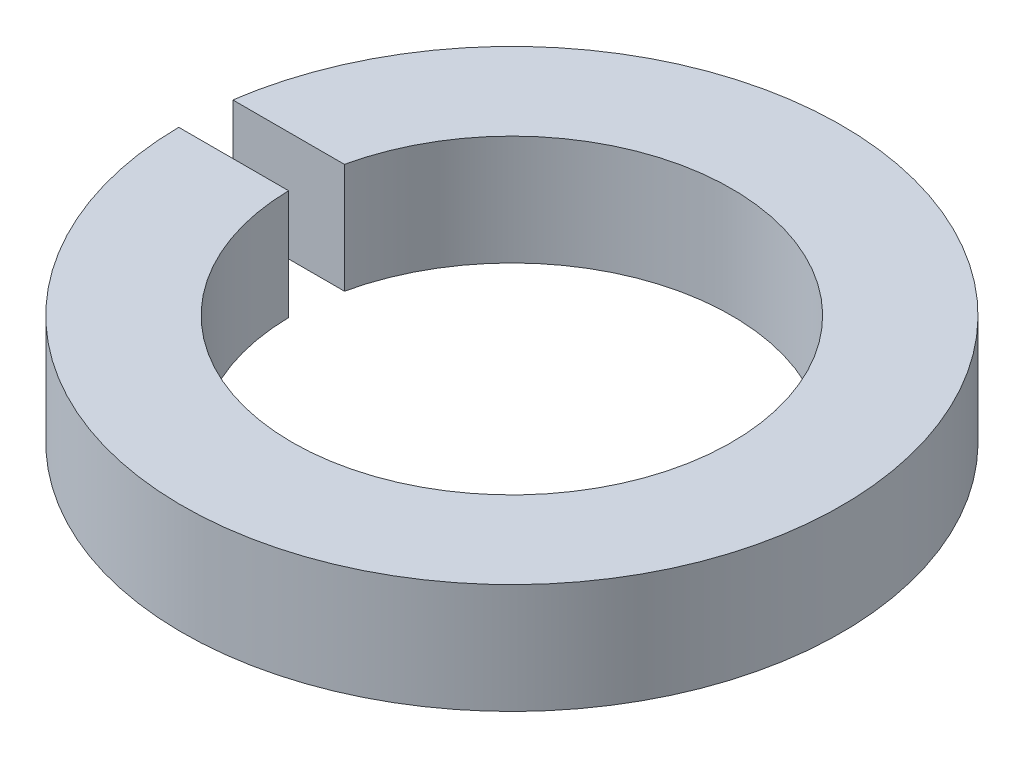
ISO-10303-21;
HEADER;
FILE_DESCRIPTION(('STEP AP214'),'2;1');
FILE_NAME('part.step','',(''),(''),'','','');
FILE_SCHEMA(('AUTOMOTIVE_DESIGN { 1 0 10303 214 1 1 1 1 }'));
ENDSEC;
DATA;
#1=APPLICATION_CONTEXT('core data for automotive mechanical design processes');
#2=APPLICATION_PROTOCOL_DEFINITION('international standard','automotive_design',2000,#1);
#3=PRODUCT_CONTEXT('',#1,'mechanical');
#4=PRODUCT('Part','Part','',(#3));
#5=PRODUCT_RELATED_PRODUCT_CATEGORY('part','',(#4));
#6=PRODUCT_DEFINITION_FORMATION('','',#4);
#7=PRODUCT_DEFINITION_CONTEXT('part definition',#1,'design');
#8=PRODUCT_DEFINITION('design','',#6,#7);
#9=PRODUCT_DEFINITION_SHAPE('','',#8);
#10=(LENGTH_UNIT() NAMED_UNIT(*) SI_UNIT(.MILLI.,.METRE.));
#11=(NAMED_UNIT(*) PLANE_ANGLE_UNIT() SI_UNIT($,.RADIAN.));
#12=(NAMED_UNIT(*) SI_UNIT($,.STERADIAN.) SOLID_ANGLE_UNIT());
#13=UNCERTAINTY_MEASURE_WITH_UNIT(LENGTH_MEASURE(1.E-05),#10,'distance_accuracy_value','');
#14=(GEOMETRIC_REPRESENTATION_CONTEXT(3) GLOBAL_UNCERTAINTY_ASSIGNED_CONTEXT((#13)) GLOBAL_UNIT_ASSIGNED_CONTEXT((#10,
#11,#12)) REPRESENTATION_CONTEXT('',''));
#15=CARTESIAN_POINT('',(0.,0.,0.));
#16=DIRECTION('',(0.,0.,1.));
#17=DIRECTION('',(1.,0.,0.));
#18=AXIS2_PLACEMENT_3D('',#15,#16,#17);
#19=CARTESIAN_POINT('',(0.,1.,0.));
#20=DIRECTION('',(0.,1.,0.));
#21=DIRECTION('',(0.,0.,1.));
#22=AXIS2_PLACEMENT_3D('',#19,#20,#21);
#23=PLANE('',#22);
#24=DIRECTION('',(-1.,0.,0.));
#25=VECTOR('',#24,1.);
#26=CARTESIAN_POINT('',(-3.33333154597426,1.,-0.429407713141927));
#27=LINE('',#26,#25);
#28=CARTESIAN_POINT('',(-1.95335839412388,1.,-0.429407713141927));
#29=VERTEX_POINT('',#28);
#30=CARTESIAN_POINT('',(-2.96910912832355,1.,-0.429407713141927));
#31=VERTEX_POINT('',#30);
#32=EDGE_CURVE('E90',#29,#31,#27,.T.);
#33=ORIENTED_EDGE('',*,*,#32,.F.);
#34=CARTESIAN_POINT('',(0.,1.,0.));
#35=DIRECTION('',(0.,1.,0.));
#36=DIRECTION('',(0.,0.,1.));
#37=AXIS2_PLACEMENT_3D('',#34,#35,#36);
#38=CIRCLE('',#37,2.);
#39=CARTESIAN_POINT('',(-1.99973649924873,1.,0.0324643430928973));
#40=VERTEX_POINT('',#39);
#41=EDGE_CURVE('E89',#40,#29,#38,.T.);
#42=ORIENTED_EDGE('',*,*,#41,.F.);
#43=DIRECTION('',(1.,0.,0.));
#44=VECTOR('',#43,1.);
#45=CARTESIAN_POINT('',(-3.33333154597426,1.,0.0324643430928973));
#46=LINE('',#45,#44);
#47=CARTESIAN_POINT('',(-2.99982433926181,1.,0.0324643430928973));
#48=VERTEX_POINT('',#47);
#49=EDGE_CURVE('E58',#48,#40,#46,.T.);
#50=ORIENTED_EDGE('',*,*,#49,.F.);
#51=CARTESIAN_POINT('',(0.,1.,0.));
#52=DIRECTION('',(0.,1.,0.));
#53=DIRECTION('',(0.,0.,1.));
#54=AXIS2_PLACEMENT_3D('',#51,#52,#53);
#55=CIRCLE('',#54,3.);
#56=EDGE_CURVE('E87',#48,#31,#55,.T.);
#57=ORIENTED_EDGE('',*,*,#56,.T.);
#58=EDGE_LOOP('',(#33,#42,#50,#57));
#59=FACE_BOUND('',#58,.T.);
#60=ADVANCED_FACE('F36',(#59),#23,.T.);
#61=CARTESIAN_POINT('',(0.,0.,0.));
#62=DIRECTION('',(0.,1.,0.));
#63=DIRECTION('',(0.,0.,1.));
#64=AXIS2_PLACEMENT_3D('',#61,#62,#63);
#65=PLANE('',#64);
#66=CARTESIAN_POINT('',(0.,0.,0.));
#67=DIRECTION('',(0.,1.,0.));
#68=DIRECTION('',(0.,0.,1.));
#69=AXIS2_PLACEMENT_3D('',#66,#67,#68);
#70=CIRCLE('',#69,2.);
#71=CARTESIAN_POINT('',(-1.99973649924872,0.,0.0324643430928973));
#72=VERTEX_POINT('',#71);
#73=CARTESIAN_POINT('',(-1.95335839412388,0.,-0.429407713141927));
#74=VERTEX_POINT('',#73);
#75=EDGE_CURVE('E98',#72,#74,#70,.T.);
#76=ORIENTED_EDGE('',*,*,#75,.T.);
#77=DIRECTION('',(-1.,0.,0.));
#78=VECTOR('',#77,1.);
#79=CARTESIAN_POINT('',(0.,0.,-0.429407713141927));
#80=LINE('',#79,#78);
#81=CARTESIAN_POINT('',(-2.96910912832355,0.,-0.429407713141927));
#82=VERTEX_POINT('',#81);
#83=EDGE_CURVE('E50',#74,#82,#80,.T.);
#84=ORIENTED_EDGE('',*,*,#83,.T.);
#85=CARTESIAN_POINT('',(0.,0.,0.));
#86=DIRECTION('',(0.,1.,0.));
#87=DIRECTION('',(0.,0.,1.));
#88=AXIS2_PLACEMENT_3D('',#85,#86,#87);
#89=CIRCLE('',#88,3.);
#90=CARTESIAN_POINT('',(-2.99982433926181,0.,0.0324643430928973));
#91=VERTEX_POINT('',#90);
#92=EDGE_CURVE('E94',#91,#82,#89,.T.);
#93=ORIENTED_EDGE('',*,*,#92,.F.);
#94=DIRECTION('',(1.,0.,0.));
#95=VECTOR('',#94,1.);
#96=CARTESIAN_POINT('',(0.,0.,0.0324643430928973));
#97=LINE('',#96,#95);
#98=EDGE_CURVE('E77',#91,#72,#97,.T.);
#99=ORIENTED_EDGE('',*,*,#98,.T.);
#100=EDGE_LOOP('',(#76,#84,#93,#99));
#101=FACE_BOUND('',#100,.T.);
#102=ADVANCED_FACE('F110',(#101),#65,.F.);
#103=CARTESIAN_POINT('',(0.,1.,0.));
#104=DIRECTION('',(0.,-1.,0.));
#105=DIRECTION('',(0.,0.,-1.));
#106=AXIS2_PLACEMENT_3D('',#103,#104,#105);
#107=CYLINDRICAL_SURFACE('',#106,3.);
#108=ORIENTED_EDGE('',*,*,#92,.T.);
#109=DIRECTION('',(0.,-1.,0.));
#110=VECTOR('',#109,1.);
#111=CARTESIAN_POINT('',(-2.96910912832355,1.,-0.429407713141927));
#112=LINE('',#111,#110);
#113=EDGE_CURVE('E93',#82,#31,#112,.F.);
#114=ORIENTED_EDGE('',*,*,#113,.T.);
#115=ORIENTED_EDGE('',*,*,#56,.F.);
#116=DIRECTION('',(0.,-1.,0.));
#117=VECTOR('',#116,1.);
#118=CARTESIAN_POINT('',(-2.99982433926181,1.,0.0324643430928973));
#119=LINE('',#118,#117);
#120=EDGE_CURVE('E74',#48,#91,#119,.T.);
#121=ORIENTED_EDGE('',*,*,#120,.T.);
#122=EDGE_LOOP('',(#108,#114,#115,#121));
#123=FACE_BOUND('',#122,.T.);
#124=ADVANCED_FACE('F38',(#123),#107,.T.);
#125=CARTESIAN_POINT('',(0.,1.,0.));
#126=DIRECTION('',(0.,-1.,0.));
#127=DIRECTION('',(0.,0.,-1.));
#128=AXIS2_PLACEMENT_3D('',#125,#126,#127);
#129=CYLINDRICAL_SURFACE('',#128,2.);
#130=DIRECTION('',(0.,-1.,0.));
#131=VECTOR('',#130,1.);
#132=CARTESIAN_POINT('',(-1.95335839412388,1.,-0.429407713141927));
#133=LINE('',#132,#131);
#134=EDGE_CURVE('E11',#74,#29,#133,.F.);
#135=ORIENTED_EDGE('',*,*,#134,.F.);
#136=ORIENTED_EDGE('',*,*,#75,.F.);
#137=DIRECTION('',(0.,-1.,0.));
#138=VECTOR('',#137,1.);
#139=CARTESIAN_POINT('',(-1.99973649924872,1.,0.0324643430928973));
#140=LINE('',#139,#138);
#141=EDGE_CURVE('E44',#40,#72,#140,.T.);
#142=ORIENTED_EDGE('',*,*,#141,.F.);
#143=ORIENTED_EDGE('',*,*,#41,.T.);
#144=EDGE_LOOP('',(#135,#136,#142,#143));
#145=FACE_BOUND('',#144,.T.);
#146=ADVANCED_FACE('F107',(#145),#129,.F.);
#147=CARTESIAN_POINT('',(-3.33333154597426,-9.,0.0324643430928973));
#148=DIRECTION('',(0.,0.,1.));
#149=DIRECTION('',(1.,0.,0.));
#150=AXIS2_PLACEMENT_3D('',#147,#148,#149);
#151=PLANE('',#150);
#152=ORIENTED_EDGE('',*,*,#49,.T.);
#153=ORIENTED_EDGE('',*,*,#141,.T.);
#154=ORIENTED_EDGE('',*,*,#98,.F.);
#155=ORIENTED_EDGE('',*,*,#120,.F.);
#156=EDGE_LOOP('',(#152,#153,#154,#155));
#157=FACE_BOUND('',#156,.T.);
#158=ADVANCED_FACE('F75',(#157),#151,.F.);
#159=CARTESIAN_POINT('',(-3.33333154597426,-9.,-0.429407713141927));
#160=DIRECTION('',(0.,0.,-1.));
#161=DIRECTION('',(-1.,0.,0.));
#162=AXIS2_PLACEMENT_3D('',#159,#160,#161);
#163=PLANE('',#162);
#164=ORIENTED_EDGE('',*,*,#83,.F.);
#165=ORIENTED_EDGE('',*,*,#134,.T.);
#166=ORIENTED_EDGE('',*,*,#32,.T.);
#167=ORIENTED_EDGE('',*,*,#113,.F.);
#168=EDGE_LOOP('',(#164,#165,#166,#167));
#169=FACE_BOUND('',#168,.T.);
#170=ADVANCED_FACE('F105',(#169),#163,.F.);
#171=CLOSED_SHELL('',(#60,#102,#124,#146,#158,#170));
#172=MANIFOLD_SOLID_BREP('B2',#171);
#173=ADVANCED_BREP_SHAPE_REPRESENTATION('',(#18,#172),#14);
#174=SHAPE_DEFINITION_REPRESENTATION(#9,#173);
ENDSEC;
END-ISO-10303-21;
